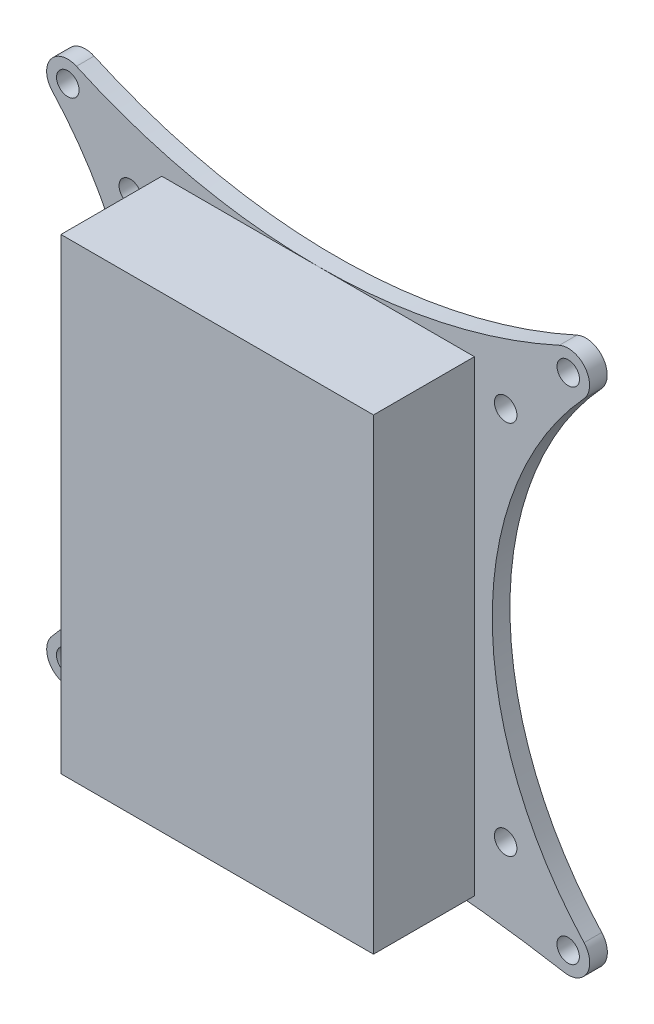
ISO-10303-21;
HEADER;
FILE_DESCRIPTION(('STEP AP214'),'2;1');
FILE_NAME('part.step','',(''),(''),'','','');
FILE_SCHEMA(('AUTOMOTIVE_DESIGN { 1 0 10303 214 1 1 1 1 }'));
ENDSEC;
DATA;
#1=APPLICATION_CONTEXT('core data for automotive mechanical design processes');
#2=APPLICATION_PROTOCOL_DEFINITION('international standard','automotive_design',2000,#1);
#3=PRODUCT_CONTEXT('',#1,'mechanical');
#4=PRODUCT('Part','Part','',(#3));
#5=PRODUCT_RELATED_PRODUCT_CATEGORY('part','',(#4));
#6=PRODUCT_DEFINITION_FORMATION('','',#4);
#7=PRODUCT_DEFINITION_CONTEXT('part definition',#1,'design');
#8=PRODUCT_DEFINITION('design','',#6,#7);
#9=PRODUCT_DEFINITION_SHAPE('','',#8);
#10=(LENGTH_UNIT() NAMED_UNIT(*) SI_UNIT(.MILLI.,.METRE.));
#11=(NAMED_UNIT(*) PLANE_ANGLE_UNIT() SI_UNIT($,.RADIAN.));
#12=(NAMED_UNIT(*) SI_UNIT($,.STERADIAN.) SOLID_ANGLE_UNIT());
#13=UNCERTAINTY_MEASURE_WITH_UNIT(LENGTH_MEASURE(1.E-05),#10,'distance_accuracy_value','');
#14=(GEOMETRIC_REPRESENTATION_CONTEXT(3) GLOBAL_UNCERTAINTY_ASSIGNED_CONTEXT((#13)) GLOBAL_UNIT_ASSIGNED_CONTEXT((#10,
#11,#12)) REPRESENTATION_CONTEXT('',''));
#15=CARTESIAN_POINT('',(0.,0.,0.));
#16=DIRECTION('',(0.,0.,1.));
#17=DIRECTION('',(1.,0.,0.));
#18=AXIS2_PLACEMENT_3D('',#15,#16,#17);
#19=CARTESIAN_POINT('',(53866.236526674,50813.0724816717,11206.9817913948));
#20=DIRECTION('',(0.,0.,1.));
#21=DIRECTION('',(1.,0.,0.));
#22=AXIS2_PLACEMENT_3D('',#19,#20,#21);
#23=PLANE('',#22);
#24=DIRECTION('',(1.,0.,0.));
#25=VECTOR('',#24,1.);
#26=CARTESIAN_POINT('',(53872.4361428547,50659.490674846,11206.9817913948));
#27=LINE('',#26,#25);
#28=CARTESIAN_POINT('',(53841.4519200088,50659.490674846,11206.9817913948));
#29=VERTEX_POINT('',#28);
#30=CARTESIAN_POINT('',(53872.4361428547,50659.490674846,11206.9817913948));
#31=VERTEX_POINT('',#30);
#32=EDGE_CURVE('E11',#29,#31,#27,.T.);
#33=ORIENTED_EDGE('',*,*,#32,.F.);
#34=CARTESIAN_POINT('',(53841.4214614553,50373.3037581029,11206.9817913948));
#35=DIRECTION('',(0.,0.,-1.));
#36=DIRECTION('',(1.,0.,0.));
#37=AXIS2_PLACEMENT_3D('',#34,#35,#36);
#38=CIRCLE('',#37,286.186918363944);
#39=CARTESIAN_POINT('',(53890.323467102,50655.2816758312,11206.9817913948));
#40=VERTEX_POINT('',#39);
#41=EDGE_CURVE('E39',#29,#40,#38,.T.);
#42=ORIENTED_EDGE('',*,*,#41,.T.);
#43=CARTESIAN_POINT('',(53891.0500709466,50659.4714066283,11206.9817913948));
#44=DIRECTION('',(0.,0.,1.));
#45=DIRECTION('',(1.,0.,0.));
#46=AXIS2_PLACEMENT_3D('',#43,#44,#45);
#47=CIRCLE('',#46,4.25226966450147);
#48=CARTESIAN_POINT('',(53894.1813340825,50662.3483822059,11206.9817913948));
#49=VERTEX_POINT('',#48);
#50=EDGE_CURVE('E184',#40,#49,#47,.T.);
#51=ORIENTED_EDGE('',*,*,#50,.T.);
#52=CARTESIAN_POINT('',(53945.0160736304,50709.0548702347,11206.9817913948));
#53=DIRECTION('',(0.,0.,-1.));
#54=DIRECTION('',(1.,0.,0.));
#55=AXIS2_PLACEMENT_3D('',#52,#53,#54);
#56=CIRCLE('',#55,69.0338088829974);
#57=CARTESIAN_POINT('',(53894.1568705471,50755.7347184631,11206.9817913948));
#58=VERTEX_POINT('',#57);
#59=EDGE_CURVE('E196',#49,#58,#56,.T.);
#60=ORIENTED_EDGE('',*,*,#59,.T.);
#61=CARTESIAN_POINT('',(53891.0311162898,50758.6036138727,11206.9817913948));
#62=DIRECTION('',(0.,0.,1.));
#63=DIRECTION('',(1.,0.,0.));
#64=AXIS2_PLACEMENT_3D('',#61,#62,#63);
#65=CIRCLE('',#64,4.24274681643765);
#66=CARTESIAN_POINT('',(53889.2733394922,50762.4651059779,11206.9817913948));
#67=VERTEX_POINT('',#66);
#68=EDGE_CURVE('E198',#58,#67,#65,.T.);
#69=ORIENTED_EDGE('',*,*,#68,.T.);
#70=CARTESIAN_POINT('',(53841.4419370583,50867.5413494708,11206.9817913948));
#71=DIRECTION('',(0.,0.,-1.));
#72=DIRECTION('',(1.,0.,0.));
#73=AXIS2_PLACEMENT_3D('',#70,#71,#72);
#74=CIRCLE('',#73,115.450682134724);
#75=CARTESIAN_POINT('',(53841.4835790701,50752.090674846,11206.9817913948));
#76=VERTEX_POINT('',#75);
#77=EDGE_CURVE('E276',#67,#76,#74,.T.);
#78=ORIENTED_EDGE('',*,*,#77,.T.);
#79=DIRECTION('',(-1.,0.,0.));
#80=VECTOR('',#79,1.);
#81=CARTESIAN_POINT('',(53872.4361428547,50752.090674846,11206.9817913948));
#82=LINE('',#81,#80);
#83=CARTESIAN_POINT('',(53872.4361428547,50752.090674846,11206.9817913948));
#84=VERTEX_POINT('',#83);
#85=EDGE_CURVE('E56',#84,#76,#82,.T.);
#86=ORIENTED_EDGE('',*,*,#85,.F.);
#87=DIRECTION('',(0.,1.,0.));
#88=VECTOR('',#87,1.);
#89=CARTESIAN_POINT('',(53872.4361428547,50659.490674846,11206.9817913948));
#90=LINE('',#89,#88);
#91=EDGE_CURVE('E52',#31,#84,#90,.T.);
#92=ORIENTED_EDGE('',*,*,#91,.F.);
#93=EDGE_LOOP('',(#33,#42,#51,#60,#69,#78,#86,#92));
#94=FACE_BOUND('',#93,.T.);
#95=CARTESIAN_POINT('',(53878.6406236784,50746.2453268224,11206.9817913948));
#96=DIRECTION('',(0.,0.,1.));
#97=DIRECTION('',(1.,0.,0.));
#98=AXIS2_PLACEMENT_3D('',#95,#96,#97);
#99=CIRCLE('',#98,2.23432855572837);
#100=CARTESIAN_POINT('',(53880.8749522341,50746.2453268224,11206.9817913948));
#101=VERTEX_POINT('',#100);
#102=EDGE_CURVE('E162',#101,#101,#99,.T.);
#103=ORIENTED_EDGE('',*,*,#102,.F.);
#104=EDGE_LOOP('',(#103));
#105=FACE_BOUND('',#104,.T.);
#106=CARTESIAN_POINT('',(53891.022819083,50659.4551482337,11206.9817913948));
#107=DIRECTION('',(0.,0.,1.));
#108=DIRECTION('',(1.,0.,0.));
#109=AXIS2_PLACEMENT_3D('',#106,#107,#108);
#110=CIRCLE('',#109,2.22119419225094);
#111=CARTESIAN_POINT('',(53893.2440132753,50659.4551482337,11206.9817913948));
#112=VERTEX_POINT('',#111);
#113=EDGE_CURVE('E296',#112,#112,#110,.T.);
#114=ORIENTED_EDGE('',*,*,#113,.F.);
#115=EDGE_LOOP('',(#114));
#116=FACE_BOUND('',#115,.T.);
#117=CARTESIAN_POINT('',(53891.0466119028,50758.6404142351,11206.9817913948));
#118=DIRECTION('',(0.,0.,1.));
#119=DIRECTION('',(1.,0.,0.));
#120=AXIS2_PLACEMENT_3D('',#117,#118,#119);
#121=CIRCLE('',#120,2.2288484259323);
#122=CARTESIAN_POINT('',(53893.2754603287,50758.6404142351,11206.9817913948));
#123=VERTEX_POINT('',#122);
#124=EDGE_CURVE('E205',#123,#123,#121,.T.);
#125=ORIENTED_EDGE('',*,*,#124,.F.);
#126=EDGE_LOOP('',(#125));
#127=FACE_BOUND('',#126,.T.);
#128=CARTESIAN_POINT('',(53878.6377604813,50671.8458577752,11206.9817913948));
#129=DIRECTION('',(0.,0.,1.));
#130=DIRECTION('',(1.,0.,0.));
#131=AXIS2_PLACEMENT_3D('',#128,#129,#130);
#132=CIRCLE('',#131,2.22926463892702);
#133=CARTESIAN_POINT('',(53880.8670251202,50671.8458577752,11206.9817913948));
#134=VERTEX_POINT('',#133);
#135=EDGE_CURVE('E302',#134,#134,#132,.T.);
#136=ORIENTED_EDGE('',*,*,#135,.F.);
#137=EDGE_LOOP('',(#136));
#138=FACE_BOUND('',#137,.T.);
#139=ADVANCED_FACE('F35',(#94,#105,#116,#127,#138),#23,.T.);
#140=CARTESIAN_POINT('',(53810.4676971633,50659.490674846,11206.9817913948));
#141=VERTEX_POINT('',#140);
#142=CARTESIAN_POINT('',(53841.3910029018,50659.490674846,11206.9817913948));
#143=VERTEX_POINT('',#142);
#144=EDGE_CURVE('E156',#141,#143,#27,.T.);
#145=ORIENTED_EDGE('',*,*,#144,.F.);
#146=DIRECTION('',(0.,-1.,0.));
#147=VECTOR('',#146,1.);
#148=CARTESIAN_POINT('',(53810.4676971633,50659.490674846,11206.9817913948));
#149=LINE('',#148,#147);
#150=CARTESIAN_POINT('',(53810.4676971633,50752.090674846,11206.9817913948));
#151=VERTEX_POINT('',#150);
#152=EDGE_CURVE('E171',#151,#141,#149,.T.);
#153=ORIENTED_EDGE('',*,*,#152,.F.);
#154=CARTESIAN_POINT('',(53841.4002950465,50752.090674846,11206.9817913948));
#155=VERTEX_POINT('',#154);
#156=EDGE_CURVE('E45',#155,#151,#82,.T.);
#157=ORIENTED_EDGE('',*,*,#156,.F.);
#158=CARTESIAN_POINT('',(53793.5347469828,50762.4996380203,11206.9817913948));
#159=VERTEX_POINT('',#158);
#160=EDGE_CURVE('E219',#155,#159,#74,.T.);
#161=ORIENTED_EDGE('',*,*,#160,.T.);
#162=CARTESIAN_POINT('',(53791.803145055,50758.7029129408,11206.9817913948));
#163=DIRECTION('',(0.,0.,1.));
#164=DIRECTION('',(1.,0.,0.));
#165=AXIS2_PLACEMENT_3D('',#162,#163,#164);
#166=CIRCLE('',#165,4.17295657371203);
#167=CARTESIAN_POINT('',(53788.7221584035,50755.8884702216,11206.9817913948));
#168=VERTEX_POINT('',#167);
#169=EDGE_CURVE('E274',#159,#168,#166,.T.);
#170=ORIENTED_EDGE('',*,*,#169,.T.);
#171=CARTESIAN_POINT('',(53737.4814415555,50709.0807171303,11206.9817913948));
#172=DIRECTION('',(0.,0.,-1.));
#173=DIRECTION('',(1.,0.,0.));
#174=AXIS2_PLACEMENT_3D('',#171,#172,#173);
#175=CIRCLE('',#174,69.4015620325751);
#176=CARTESIAN_POINT('',(53788.7423088421,50662.2950323796,11206.9817913948));
#177=VERTEX_POINT('',#176);
#178=EDGE_CURVE('E270',#168,#177,#175,.T.);
#179=ORIENTED_EDGE('',*,*,#178,.T.);
#180=CARTESIAN_POINT('',(53791.8592697381,50659.4501887868,11206.9817913948));
#181=DIRECTION('',(0.,0.,1.));
#182=DIRECTION('',(1.,0.,0.));
#183=AXIS2_PLACEMENT_3D('',#180,#181,#182);
#184=CIRCLE('',#183,4.22002136193234);
#185=CARTESIAN_POINT('',(53792.579478105,50655.2920786147,11206.9817913948));
#186=VERTEX_POINT('',#185);
#187=EDGE_CURVE('E192',#177,#186,#184,.T.);
#188=ORIENTED_EDGE('',*,*,#187,.T.);
#189=EDGE_CURVE('E182',#186,#143,#38,.T.);
#190=ORIENTED_EDGE('',*,*,#189,.T.);
#191=EDGE_LOOP('',(#145,#153,#157,#161,#170,#179,#188,#190));
#192=FACE_BOUND('',#191,.T.);
#193=CARTESIAN_POINT('',(53804.2219001641,50746.2488154693,11206.9817913948));
#194=DIRECTION('',(0.,0.,1.));
#195=DIRECTION('',(1.,0.,0.));
#196=AXIS2_PLACEMENT_3D('',#193,#194,#195);
#197=CIRCLE('',#196,2.22796232855812);
#198=CARTESIAN_POINT('',(53806.4498624927,50746.2488154693,11206.9817913948));
#199=VERTEX_POINT('',#198);
#200=EDGE_CURVE('E314',#199,#199,#197,.T.);
#201=ORIENTED_EDGE('',*,*,#200,.F.);
#202=EDGE_LOOP('',(#201));
#203=FACE_BOUND('',#202,.T.);
#204=CARTESIAN_POINT('',(53791.8266657831,50659.465130778,11206.9817913948));
#205=DIRECTION('',(0.,0.,1.));
#206=DIRECTION('',(1.,0.,0.));
#207=AXIS2_PLACEMENT_3D('',#204,#205,#206);
#208=CIRCLE('',#207,2.25538363704637);
#209=CARTESIAN_POINT('',(53794.0820494202,50659.465130778,11206.9817913948));
#210=VERTEX_POINT('',#209);
#211=EDGE_CURVE('E290',#210,#210,#208,.T.);
#212=ORIENTED_EDGE('',*,*,#211,.F.);
#213=EDGE_LOOP('',(#212));
#214=FACE_BOUND('',#213,.T.);
#215=CARTESIAN_POINT('',(53791.8279905263,50758.6482130844,11206.9817913948));
#216=DIRECTION('',(0.,0.,1.));
#217=DIRECTION('',(1.,0.,0.));
#218=AXIS2_PLACEMENT_3D('',#215,#216,#217);
#219=CIRCLE('',#218,2.23251509569496);
#220=CARTESIAN_POINT('',(53794.060505622,50758.6482130844,11206.9817913948));
#221=VERTEX_POINT('',#220);
#222=EDGE_CURVE('E284',#221,#221,#219,.T.);
#223=ORIENTED_EDGE('',*,*,#222,.F.);
#224=EDGE_LOOP('',(#223));
#225=FACE_BOUND('',#224,.T.);
#226=CARTESIAN_POINT('',(53804.2099616032,50671.8274460977,11206.9817913948));
#227=DIRECTION('',(0.,0.,1.));
#228=DIRECTION('',(1.,0.,0.));
#229=AXIS2_PLACEMENT_3D('',#226,#227,#228);
#230=CIRCLE('',#229,2.22215325220402);
#231=CARTESIAN_POINT('',(53806.4321148554,50671.8274460977,11206.9817913948));
#232=VERTEX_POINT('',#231);
#233=EDGE_CURVE('E308',#232,#232,#230,.T.);
#234=ORIENTED_EDGE('',*,*,#233,.F.);
#235=EDGE_LOOP('',(#234));
#236=FACE_BOUND('',#235,.T.);
#237=ADVANCED_FACE('F376',(#192,#203,#214,#225,#236),#23,.T.);
#238=CARTESIAN_POINT('',(53866.236526674,50813.0724816717,11203.4817913948));
#239=DIRECTION('',(0.,0.,1.));
#240=DIRECTION('',(1.,0.,0.));
#241=AXIS2_PLACEMENT_3D('',#238,#239,#240);
#242=PLANE('',#241);
#243=CARTESIAN_POINT('',(53841.4419370583,50867.5413494708,11203.4817913948));
#244=DIRECTION('',(0.,0.,-1.));
#245=DIRECTION('',(1.,0.,0.));
#246=AXIS2_PLACEMENT_3D('',#243,#244,#245);
#247=CIRCLE('',#246,115.450682134724);
#248=CARTESIAN_POINT('',(53889.2733394922,50762.4651059779,11203.4817913948));
#249=VERTEX_POINT('',#248);
#250=CARTESIAN_POINT('',(53793.5347469828,50762.4996380203,11203.4817913948));
#251=VERTEX_POINT('',#250);
#252=EDGE_CURVE('E201',#249,#251,#247,.T.);
#253=ORIENTED_EDGE('',*,*,#252,.F.);
#254=CARTESIAN_POINT('',(53891.0311162898,50758.6036138727,11203.4817913948));
#255=DIRECTION('',(0.,0.,1.));
#256=DIRECTION('',(1.,0.,0.));
#257=AXIS2_PLACEMENT_3D('',#254,#255,#256);
#258=CIRCLE('',#257,4.24274681643765);
#259=CARTESIAN_POINT('',(53894.1568705471,50755.7347184631,11203.4817913948));
#260=VERTEX_POINT('',#259);
#261=EDGE_CURVE('E217',#260,#249,#258,.T.);
#262=ORIENTED_EDGE('',*,*,#261,.F.);
#263=CARTESIAN_POINT('',(53945.0160736304,50709.0548702347,11203.4817913948));
#264=DIRECTION('',(0.,0.,-1.));
#265=DIRECTION('',(1.,0.,0.));
#266=AXIS2_PLACEMENT_3D('',#263,#264,#265);
#267=CIRCLE('',#266,69.0338088829974);
#268=CARTESIAN_POINT('',(53894.1813340825,50662.3483822059,11203.4817913948));
#269=VERTEX_POINT('',#268);
#270=EDGE_CURVE('E215',#269,#260,#267,.T.);
#271=ORIENTED_EDGE('',*,*,#270,.F.);
#272=CARTESIAN_POINT('',(53891.0500709466,50659.4714066283,11203.4817913948));
#273=DIRECTION('',(0.,0.,1.));
#274=DIRECTION('',(1.,0.,0.));
#275=AXIS2_PLACEMENT_3D('',#272,#273,#274);
#276=CIRCLE('',#275,4.25226966450147);
#277=CARTESIAN_POINT('',(53890.323467102,50655.2816758312,11203.4817913948));
#278=VERTEX_POINT('',#277);
#279=EDGE_CURVE('E213',#278,#269,#276,.T.);
#280=ORIENTED_EDGE('',*,*,#279,.F.);
#281=CARTESIAN_POINT('',(53841.4214614553,50373.3037581029,11203.4817913948));
#282=DIRECTION('',(0.,0.,-1.));
#283=DIRECTION('',(1.,0.,0.));
#284=AXIS2_PLACEMENT_3D('',#281,#282,#283);
#285=CIRCLE('',#284,286.186918363944);
#286=CARTESIAN_POINT('',(53792.579478105,50655.2920786147,11203.4817913948));
#287=VERTEX_POINT('',#286);
#288=EDGE_CURVE('E211',#287,#278,#285,.T.);
#289=ORIENTED_EDGE('',*,*,#288,.F.);
#290=CARTESIAN_POINT('',(53791.8592697381,50659.4501887868,11203.4817913948));
#291=DIRECTION('',(0.,0.,1.));
#292=DIRECTION('',(1.,0.,0.));
#293=AXIS2_PLACEMENT_3D('',#290,#291,#292);
#294=CIRCLE('',#293,4.22002136193234);
#295=CARTESIAN_POINT('',(53788.7423088421,50662.2950323796,11203.4817913948));
#296=VERTEX_POINT('',#295);
#297=EDGE_CURVE('E209',#296,#287,#294,.T.);
#298=ORIENTED_EDGE('',*,*,#297,.F.);
#299=CARTESIAN_POINT('',(53737.4814415555,50709.0807171303,11203.4817913948));
#300=DIRECTION('',(0.,0.,-1.));
#301=DIRECTION('',(1.,0.,0.));
#302=AXIS2_PLACEMENT_3D('',#299,#300,#301);
#303=CIRCLE('',#302,69.4015620325751);
#304=CARTESIAN_POINT('',(53788.7221584035,50755.8884702216,11203.4817913948));
#305=VERTEX_POINT('',#304);
#306=EDGE_CURVE('E207',#305,#296,#303,.T.);
#307=ORIENTED_EDGE('',*,*,#306,.F.);
#308=CARTESIAN_POINT('',(53791.803145055,50758.7029129408,11203.4817913948));
#309=DIRECTION('',(0.,0.,1.));
#310=DIRECTION('',(1.,0.,0.));
#311=AXIS2_PLACEMENT_3D('',#308,#309,#310);
#312=CIRCLE('',#311,4.17295657371203);
#313=EDGE_CURVE('E204',#251,#305,#312,.T.);
#314=ORIENTED_EDGE('',*,*,#313,.F.);
#315=EDGE_LOOP('',(#253,#262,#271,#280,#289,#298,#307,#314));
#316=FACE_BOUND('',#315,.T.);
#317=CARTESIAN_POINT('',(53891.0466119028,50758.6404142351,11203.4817913948));
#318=DIRECTION('',(0.,0.,1.));
#319=DIRECTION('',(1.,0.,0.));
#320=AXIS2_PLACEMENT_3D('',#317,#318,#319);
#321=CIRCLE('',#320,2.2288484259323);
#322=CARTESIAN_POINT('',(53893.2754603287,50758.6404142351,11203.4817913948));
#323=VERTEX_POINT('',#322);
#324=EDGE_CURVE('E281',#323,#323,#321,.T.);
#325=ORIENTED_EDGE('',*,*,#324,.T.);
#326=EDGE_LOOP('',(#325));
#327=FACE_BOUND('',#326,.T.);
#328=CARTESIAN_POINT('',(53791.8279905263,50758.6482130844,11203.4817913948));
#329=DIRECTION('',(0.,0.,1.));
#330=DIRECTION('',(1.,0.,0.));
#331=AXIS2_PLACEMENT_3D('',#328,#329,#330);
#332=CIRCLE('',#331,2.23251509569496);
#333=CARTESIAN_POINT('',(53794.060505622,50758.6482130844,11203.4817913948));
#334=VERTEX_POINT('',#333);
#335=EDGE_CURVE('E287',#334,#334,#332,.T.);
#336=ORIENTED_EDGE('',*,*,#335,.T.);
#337=EDGE_LOOP('',(#336));
#338=FACE_BOUND('',#337,.T.);
#339=CARTESIAN_POINT('',(53791.8266657831,50659.465130778,11203.4817913948));
#340=DIRECTION('',(0.,0.,1.));
#341=DIRECTION('',(1.,0.,0.));
#342=AXIS2_PLACEMENT_3D('',#339,#340,#341);
#343=CIRCLE('',#342,2.25538363704637);
#344=CARTESIAN_POINT('',(53794.0820494202,50659.465130778,11203.4817913948));
#345=VERTEX_POINT('',#344);
#346=EDGE_CURVE('E293',#345,#345,#343,.T.);
#347=ORIENTED_EDGE('',*,*,#346,.T.);
#348=EDGE_LOOP('',(#347));
#349=FACE_BOUND('',#348,.T.);
#350=CARTESIAN_POINT('',(53891.022819083,50659.4551482337,11203.4817913948));
#351=DIRECTION('',(0.,0.,1.));
#352=DIRECTION('',(1.,0.,0.));
#353=AXIS2_PLACEMENT_3D('',#350,#351,#352);
#354=CIRCLE('',#353,2.22119419225094);
#355=CARTESIAN_POINT('',(53893.2440132753,50659.4551482337,11203.4817913948));
#356=VERTEX_POINT('',#355);
#357=EDGE_CURVE('E299',#356,#356,#354,.T.);
#358=ORIENTED_EDGE('',*,*,#357,.T.);
#359=EDGE_LOOP('',(#358));
#360=FACE_BOUND('',#359,.T.);
#361=CARTESIAN_POINT('',(53878.6377604813,50671.8458577752,11203.4817913948));
#362=DIRECTION('',(0.,0.,1.));
#363=DIRECTION('',(1.,0.,0.));
#364=AXIS2_PLACEMENT_3D('',#361,#362,#363);
#365=CIRCLE('',#364,2.22926463892702);
#366=CARTESIAN_POINT('',(53880.8670251202,50671.8458577752,11203.4817913948));
#367=VERTEX_POINT('',#366);
#368=EDGE_CURVE('E305',#367,#367,#365,.T.);
#369=ORIENTED_EDGE('',*,*,#368,.T.);
#370=EDGE_LOOP('',(#369));
#371=FACE_BOUND('',#370,.T.);
#372=CARTESIAN_POINT('',(53804.2099616032,50671.8274460977,11203.4817913948));
#373=DIRECTION('',(0.,0.,1.));
#374=DIRECTION('',(1.,0.,0.));
#375=AXIS2_PLACEMENT_3D('',#372,#373,#374);
#376=CIRCLE('',#375,2.22215325220402);
#377=CARTESIAN_POINT('',(53806.4321148554,50671.8274460977,11203.4817913948));
#378=VERTEX_POINT('',#377);
#379=EDGE_CURVE('E311',#378,#378,#376,.T.);
#380=ORIENTED_EDGE('',*,*,#379,.T.);
#381=EDGE_LOOP('',(#380));
#382=FACE_BOUND('',#381,.T.);
#383=CARTESIAN_POINT('',(53804.2219001641,50746.2488154693,11203.4817913948));
#384=DIRECTION('',(0.,0.,1.));
#385=DIRECTION('',(1.,0.,0.));
#386=AXIS2_PLACEMENT_3D('',#383,#384,#385);
#387=CIRCLE('',#386,2.22796232855812);
#388=CARTESIAN_POINT('',(53806.4498624927,50746.2488154693,11203.4817913948));
#389=VERTEX_POINT('',#388);
#390=EDGE_CURVE('E317',#389,#389,#387,.T.);
#391=ORIENTED_EDGE('',*,*,#390,.T.);
#392=EDGE_LOOP('',(#391));
#393=FACE_BOUND('',#392,.T.);
#394=CARTESIAN_POINT('',(53878.6406236784,50746.2453268224,11203.4817913948));
#395=DIRECTION('',(0.,0.,1.));
#396=DIRECTION('',(1.,0.,0.));
#397=AXIS2_PLACEMENT_3D('',#394,#395,#396);
#398=CIRCLE('',#397,2.23432855572837);
#399=CARTESIAN_POINT('',(53880.8749522341,50746.2453268224,11203.4817913948));
#400=VERTEX_POINT('',#399);
#401=EDGE_CURVE('E159',#400,#400,#398,.T.);
#402=ORIENTED_EDGE('',*,*,#401,.T.);
#403=EDGE_LOOP('',(#402));
#404=FACE_BOUND('',#403,.T.);
#405=ADVANCED_FACE('F379',(#316,#327,#338,#349,#360,#371,#382,#393,#404),#242,.F.);
#406=CARTESIAN_POINT('',(53841.4419370583,50867.5413494708,11206.9817913948));
#407=DIRECTION('',(0.,0.,-1.));
#408=DIRECTION('',(-1.,0.,0.));
#409=AXIS2_PLACEMENT_3D('',#406,#407,#408);
#410=CYLINDRICAL_SURFACE('',#409,115.450682134724);
#411=ORIENTED_EDGE('',*,*,#252,.T.);
#412=DIRECTION('',(0.,0.,-1.));
#413=VECTOR('',#412,1.);
#414=CARTESIAN_POINT('',(53793.5347469828,50762.4996380203,11206.9817913948));
#415=LINE('',#414,#413);
#416=EDGE_CURVE('E177',#159,#251,#415,.T.);
#417=ORIENTED_EDGE('',*,*,#416,.F.);
#418=ORIENTED_EDGE('',*,*,#160,.F.);
#419=EDGE_CURVE('E280',#76,#155,#74,.T.);
#420=ORIENTED_EDGE('',*,*,#419,.F.);
#421=ORIENTED_EDGE('',*,*,#77,.F.);
#422=DIRECTION('',(0.,0.,-1.));
#423=VECTOR('',#422,1.);
#424=CARTESIAN_POINT('',(53889.2733394922,50762.4651059779,11206.9817913948));
#425=LINE('',#424,#423);
#426=EDGE_CURVE('E200',#67,#249,#425,.T.);
#427=ORIENTED_EDGE('',*,*,#426,.T.);
#428=EDGE_LOOP('',(#411,#417,#418,#420,#421,#427));
#429=FACE_BOUND('',#428,.T.);
#430=ADVANCED_FACE('F37',(#429),#410,.F.);
#431=CARTESIAN_POINT('',(53791.803145055,50758.7029129408,11206.9817913948));
#432=DIRECTION('',(0.,0.,-1.));
#433=DIRECTION('',(-1.,0.,0.));
#434=AXIS2_PLACEMENT_3D('',#431,#432,#433);
#435=CYLINDRICAL_SURFACE('',#434,4.17295657371203);
#436=ORIENTED_EDGE('',*,*,#313,.T.);
#437=DIRECTION('',(0.,0.,-1.));
#438=VECTOR('',#437,1.);
#439=CARTESIAN_POINT('',(53788.7221584035,50755.8884702216,11206.9817913948));
#440=LINE('',#439,#438);
#441=EDGE_CURVE('E236',#168,#305,#440,.T.);
#442=ORIENTED_EDGE('',*,*,#441,.F.);
#443=ORIENTED_EDGE('',*,*,#169,.F.);
#444=ORIENTED_EDGE('',*,*,#416,.T.);
#445=EDGE_LOOP('',(#436,#442,#443,#444));
#446=FACE_BOUND('',#445,.T.);
#447=ADVANCED_FACE('F402',(#446),#435,.T.);
#448=CARTESIAN_POINT('',(53737.4814415555,50709.0807171303,11206.9817913948));
#449=DIRECTION('',(0.,0.,-1.));
#450=DIRECTION('',(-1.,0.,0.));
#451=AXIS2_PLACEMENT_3D('',#448,#449,#450);
#452=CYLINDRICAL_SURFACE('',#451,69.4015620325751);
#453=ORIENTED_EDGE('',*,*,#306,.T.);
#454=DIRECTION('',(0.,0.,-1.));
#455=VECTOR('',#454,1.);
#456=CARTESIAN_POINT('',(53788.7423088421,50662.2950323796,11206.9817913948));
#457=LINE('',#456,#455);
#458=EDGE_CURVE('E234',#177,#296,#457,.T.);
#459=ORIENTED_EDGE('',*,*,#458,.F.);
#460=ORIENTED_EDGE('',*,*,#178,.F.);
#461=ORIENTED_EDGE('',*,*,#441,.T.);
#462=EDGE_LOOP('',(#453,#459,#460,#461));
#463=FACE_BOUND('',#462,.T.);
#464=ADVANCED_FACE('F399',(#463),#452,.F.);
#465=CARTESIAN_POINT('',(53791.8592697381,50659.4501887868,11206.9817913948));
#466=DIRECTION('',(0.,0.,-1.));
#467=DIRECTION('',(-1.,0.,0.));
#468=AXIS2_PLACEMENT_3D('',#465,#466,#467);
#469=CYLINDRICAL_SURFACE('',#468,4.22002136193234);
#470=ORIENTED_EDGE('',*,*,#297,.T.);
#471=DIRECTION('',(0.,0.,-1.));
#472=VECTOR('',#471,1.);
#473=CARTESIAN_POINT('',(53792.579478105,50655.2920786147,11206.9817913948));
#474=LINE('',#473,#472);
#475=EDGE_CURVE('E231',#186,#287,#474,.T.);
#476=ORIENTED_EDGE('',*,*,#475,.F.);
#477=ORIENTED_EDGE('',*,*,#187,.F.);
#478=ORIENTED_EDGE('',*,*,#458,.T.);
#479=EDGE_LOOP('',(#470,#476,#477,#478));
#480=FACE_BOUND('',#479,.T.);
#481=ADVANCED_FACE('F396',(#480),#469,.T.);
#482=CARTESIAN_POINT('',(53841.4214614553,50373.3037581029,11206.9817913948));
#483=DIRECTION('',(0.,0.,-1.));
#484=DIRECTION('',(-1.,0.,0.));
#485=AXIS2_PLACEMENT_3D('',#482,#483,#484);
#486=CYLINDRICAL_SURFACE('',#485,286.186918363944);
#487=ORIENTED_EDGE('',*,*,#288,.T.);
#488=DIRECTION('',(0.,0.,-1.));
#489=VECTOR('',#488,1.);
#490=CARTESIAN_POINT('',(53890.323467102,50655.2816758312,11206.9817913948));
#491=LINE('',#490,#489);
#492=EDGE_CURVE('E228',#40,#278,#491,.T.);
#493=ORIENTED_EDGE('',*,*,#492,.F.);
#494=ORIENTED_EDGE('',*,*,#41,.F.);
#495=CARTESIAN_POINT('',(53841.3910029018,50659.490674846,11206.9817913948));
#496=DIRECTION('',(1.,0.,0.));
#497=VECTOR('',#496,1.);
#498=LINE('',#495,#497);
#499=EDGE_CURVE('E185',#143,#29,#498,.T.);
#500=ORIENTED_EDGE('',*,*,#499,.F.);
#501=ORIENTED_EDGE('',*,*,#189,.F.);
#502=ORIENTED_EDGE('',*,*,#475,.T.);
#503=EDGE_LOOP('',(#487,#493,#494,#500,#501,#502));
#504=FACE_BOUND('',#503,.T.);
#505=ADVANCED_FACE('F267',(#504),#486,.F.);
#506=CARTESIAN_POINT('',(53891.0500709466,50659.4714066283,11206.9817913948));
#507=DIRECTION('',(0.,0.,-1.));
#508=DIRECTION('',(-1.,0.,0.));
#509=AXIS2_PLACEMENT_3D('',#506,#507,#508);
#510=CYLINDRICAL_SURFACE('',#509,4.25226966450147);
#511=ORIENTED_EDGE('',*,*,#279,.T.);
#512=DIRECTION('',(0.,0.,-1.));
#513=VECTOR('',#512,1.);
#514=CARTESIAN_POINT('',(53894.1813340825,50662.3483822059,11206.9817913948));
#515=LINE('',#514,#513);
#516=EDGE_CURVE('E225',#49,#269,#515,.T.);
#517=ORIENTED_EDGE('',*,*,#516,.F.);
#518=ORIENTED_EDGE('',*,*,#50,.F.);
#519=ORIENTED_EDGE('',*,*,#492,.T.);
#520=EDGE_LOOP('',(#511,#517,#518,#519));
#521=FACE_BOUND('',#520,.T.);
#522=ADVANCED_FACE('F389',(#521),#510,.T.);
#523=CARTESIAN_POINT('',(53945.0160736304,50709.0548702347,11206.9817913948));
#524=DIRECTION('',(0.,0.,-1.));
#525=DIRECTION('',(-1.,0.,0.));
#526=AXIS2_PLACEMENT_3D('',#523,#524,#525);
#527=CYLINDRICAL_SURFACE('',#526,69.0338088829974);
#528=ORIENTED_EDGE('',*,*,#270,.T.);
#529=DIRECTION('',(0.,0.,-1.));
#530=VECTOR('',#529,1.);
#531=CARTESIAN_POINT('',(53894.1568705471,50755.7347184631,11206.9817913948));
#532=LINE('',#531,#530);
#533=EDGE_CURVE('E222',#58,#260,#532,.T.);
#534=ORIENTED_EDGE('',*,*,#533,.F.);
#535=ORIENTED_EDGE('',*,*,#59,.F.);
#536=ORIENTED_EDGE('',*,*,#516,.T.);
#537=EDGE_LOOP('',(#528,#534,#535,#536));
#538=FACE_BOUND('',#537,.T.);
#539=ADVANCED_FACE('F385',(#538),#527,.F.);
#540=CARTESIAN_POINT('',(53891.0311162898,50758.6036138727,11206.9817913948));
#541=DIRECTION('',(0.,0.,-1.));
#542=DIRECTION('',(-1.,0.,0.));
#543=AXIS2_PLACEMENT_3D('',#540,#541,#542);
#544=CYLINDRICAL_SURFACE('',#543,4.24274681643765);
#545=ORIENTED_EDGE('',*,*,#261,.T.);
#546=ORIENTED_EDGE('',*,*,#426,.F.);
#547=ORIENTED_EDGE('',*,*,#68,.F.);
#548=ORIENTED_EDGE('',*,*,#533,.T.);
#549=EDGE_LOOP('',(#545,#546,#547,#548));
#550=FACE_BOUND('',#549,.T.);
#551=ADVANCED_FACE('F374',(#550),#544,.T.);
#552=CARTESIAN_POINT('',(53891.0466119028,50758.6404142351,11206.9817913948));
#553=DIRECTION('',(0.,0.,-1.));
#554=DIRECTION('',(-1.,0.,0.));
#555=AXIS2_PLACEMENT_3D('',#552,#553,#554);
#556=CYLINDRICAL_SURFACE('',#555,2.2288484259323);
#557=ORIENTED_EDGE('',*,*,#124,.T.);
#558=EDGE_LOOP('',(#557));
#559=FACE_BOUND('',#558,.T.);
#560=ORIENTED_EDGE('',*,*,#324,.F.);
#561=EDGE_LOOP('',(#560));
#562=FACE_BOUND('',#561,.T.);
#563=ADVANCED_FACE('F370',(#559,#562),#556,.F.);
#564=CARTESIAN_POINT('',(53791.8279905263,50758.6482130844,11206.9817913948));
#565=DIRECTION('',(0.,0.,-1.));
#566=DIRECTION('',(-1.,0.,0.));
#567=AXIS2_PLACEMENT_3D('',#564,#565,#566);
#568=CYLINDRICAL_SURFACE('',#567,2.23251509569496);
#569=ORIENTED_EDGE('',*,*,#222,.T.);
#570=EDGE_LOOP('',(#569));
#571=FACE_BOUND('',#570,.T.);
#572=ORIENTED_EDGE('',*,*,#335,.F.);
#573=EDGE_LOOP('',(#572));
#574=FACE_BOUND('',#573,.T.);
#575=ADVANCED_FACE('F366',(#571,#574),#568,.F.);
#576=CARTESIAN_POINT('',(53791.8266657831,50659.465130778,11206.9817913948));
#577=DIRECTION('',(0.,0.,-1.));
#578=DIRECTION('',(-1.,0.,0.));
#579=AXIS2_PLACEMENT_3D('',#576,#577,#578);
#580=CYLINDRICAL_SURFACE('',#579,2.25538363704637);
#581=ORIENTED_EDGE('',*,*,#211,.T.);
#582=EDGE_LOOP('',(#581));
#583=FACE_BOUND('',#582,.T.);
#584=ORIENTED_EDGE('',*,*,#346,.F.);
#585=EDGE_LOOP('',(#584));
#586=FACE_BOUND('',#585,.T.);
#587=ADVANCED_FACE('F362',(#583,#586),#580,.F.);
#588=CARTESIAN_POINT('',(53891.022819083,50659.4551482337,11206.9817913948));
#589=DIRECTION('',(0.,0.,-1.));
#590=DIRECTION('',(-1.,0.,0.));
#591=AXIS2_PLACEMENT_3D('',#588,#589,#590);
#592=CYLINDRICAL_SURFACE('',#591,2.22119419225094);
#593=ORIENTED_EDGE('',*,*,#113,.T.);
#594=EDGE_LOOP('',(#593));
#595=FACE_BOUND('',#594,.T.);
#596=ORIENTED_EDGE('',*,*,#357,.F.);
#597=EDGE_LOOP('',(#596));
#598=FACE_BOUND('',#597,.T.);
#599=ADVANCED_FACE('F358',(#595,#598),#592,.F.);
#600=CARTESIAN_POINT('',(53878.6377604813,50671.8458577752,11206.9817913948));
#601=DIRECTION('',(0.,0.,-1.));
#602=DIRECTION('',(-1.,0.,0.));
#603=AXIS2_PLACEMENT_3D('',#600,#601,#602);
#604=CYLINDRICAL_SURFACE('',#603,2.22926463892702);
#605=ORIENTED_EDGE('',*,*,#135,.T.);
#606=EDGE_LOOP('',(#605));
#607=FACE_BOUND('',#606,.T.);
#608=ORIENTED_EDGE('',*,*,#368,.F.);
#609=EDGE_LOOP('',(#608));
#610=FACE_BOUND('',#609,.T.);
#611=ADVANCED_FACE('F354',(#607,#610),#604,.F.);
#612=CARTESIAN_POINT('',(53804.2099616032,50671.8274460977,11206.9817913948));
#613=DIRECTION('',(0.,0.,-1.));
#614=DIRECTION('',(-1.,0.,0.));
#615=AXIS2_PLACEMENT_3D('',#612,#613,#614);
#616=CYLINDRICAL_SURFACE('',#615,2.22215325220402);
#617=ORIENTED_EDGE('',*,*,#233,.T.);
#618=EDGE_LOOP('',(#617));
#619=FACE_BOUND('',#618,.T.);
#620=ORIENTED_EDGE('',*,*,#379,.F.);
#621=EDGE_LOOP('',(#620));
#622=FACE_BOUND('',#621,.T.);
#623=ADVANCED_FACE('F350',(#619,#622),#616,.F.);
#624=CARTESIAN_POINT('',(53804.2219001641,50746.2488154693,11206.9817913948));
#625=DIRECTION('',(0.,0.,-1.));
#626=DIRECTION('',(-1.,0.,0.));
#627=AXIS2_PLACEMENT_3D('',#624,#625,#626);
#628=CYLINDRICAL_SURFACE('',#627,2.22796232855812);
#629=ORIENTED_EDGE('',*,*,#200,.T.);
#630=EDGE_LOOP('',(#629));
#631=FACE_BOUND('',#630,.T.);
#632=ORIENTED_EDGE('',*,*,#390,.F.);
#633=EDGE_LOOP('',(#632));
#634=FACE_BOUND('',#633,.T.);
#635=ADVANCED_FACE('F346',(#631,#634),#628,.F.);
#636=CARTESIAN_POINT('',(53878.6406236784,50746.2453268224,11206.9817913948));
#637=DIRECTION('',(0.,0.,-1.));
#638=DIRECTION('',(-1.,0.,0.));
#639=AXIS2_PLACEMENT_3D('',#636,#637,#638);
#640=CYLINDRICAL_SURFACE('',#639,2.23432855572837);
#641=ORIENTED_EDGE('',*,*,#102,.T.);
#642=EDGE_LOOP('',(#641));
#643=FACE_BOUND('',#642,.T.);
#644=ORIENTED_EDGE('',*,*,#401,.F.);
#645=EDGE_LOOP('',(#644));
#646=FACE_BOUND('',#645,.T.);
#647=ADVANCED_FACE('F343',(#643,#646),#640,.F.);
#648=CARTESIAN_POINT('',(53787.6117906616,50655.2162816369,11206.9817913948));
#649=DIRECTION('',(0.,0.,1.));
#650=DIRECTION('',(1.,0.,0.));
#651=AXIS2_PLACEMENT_3D('',#648,#649,#650);
#652=PLANE('',#651);
#653=EDGE_CURVE('E247',#76,#155,#82,.T.);
#654=ORIENTED_EDGE('',*,*,#653,.F.);
#655=ORIENTED_EDGE('',*,*,#419,.T.);
#656=EDGE_LOOP('',(#654,#655));
#657=FACE_BOUND('',#656,.T.);
#658=ADVANCED_FACE('F335',(#657),#652,.F.);
#659=CARTESIAN_POINT('',(53872.4361428547,50659.490674846,11226.9817913948));
#660=DIRECTION('',(-1.,0.,0.));
#661=DIRECTION('',(0.,-1.,0.));
#662=AXIS2_PLACEMENT_3D('',#659,#660,#661);
#663=PLANE('',#662);
#664=ORIENTED_EDGE('',*,*,#91,.T.);
#665=DIRECTION('',(0.,0.,-1.));
#666=VECTOR('',#665,1.);
#667=CARTESIAN_POINT('',(53872.4361428547,50752.090674846,11226.9817913948));
#668=LINE('',#667,#666);
#669=CARTESIAN_POINT('',(53872.4361428547,50752.090674846,11226.9817913948));
#670=VERTEX_POINT('',#669);
#671=EDGE_CURVE('E140',#670,#84,#668,.T.);
#672=ORIENTED_EDGE('',*,*,#671,.F.);
#673=DIRECTION('',(0.,1.,0.));
#674=VECTOR('',#673,1.);
#675=CARTESIAN_POINT('',(53872.4361428547,50659.490674846,11226.9817913948));
#676=LINE('',#675,#674);
#677=CARTESIAN_POINT('',(53872.4361428547,50659.490674846,11226.9817913948));
#678=VERTEX_POINT('',#677);
#679=EDGE_CURVE('E147',#678,#670,#676,.T.);
#680=ORIENTED_EDGE('',*,*,#679,.F.);
#681=DIRECTION('',(0.,0.,-1.));
#682=VECTOR('',#681,1.);
#683=CARTESIAN_POINT('',(53872.4361428547,50659.490674846,11226.9817913948));
#684=LINE('',#683,#682);
#685=EDGE_CURVE('E254',#678,#31,#684,.T.);
#686=ORIENTED_EDGE('',*,*,#685,.T.);
#687=EDGE_LOOP('',(#664,#672,#680,#686));
#688=FACE_BOUND('',#687,.T.);
#689=ADVANCED_FACE('F158',(#688),#663,.F.);
#690=CARTESIAN_POINT('',(53872.4361428547,50752.090674846,11226.9817913948));
#691=DIRECTION('',(0.,-1.,0.));
#692=DIRECTION('',(1.,0.,0.));
#693=AXIS2_PLACEMENT_3D('',#690,#691,#692);
#694=PLANE('',#693);
#695=ORIENTED_EDGE('',*,*,#85,.T.);
#696=ORIENTED_EDGE('',*,*,#653,.T.);
#697=ORIENTED_EDGE('',*,*,#156,.T.);
#698=DIRECTION('',(0.,0.,-1.));
#699=VECTOR('',#698,1.);
#700=CARTESIAN_POINT('',(53810.4676971633,50752.090674846,11226.9817913948));
#701=LINE('',#700,#699);
#702=CARTESIAN_POINT('',(53810.4676971633,50752.090674846,11226.9817913948));
#703=VERTEX_POINT('',#702);
#704=EDGE_CURVE('E143',#703,#151,#701,.T.);
#705=ORIENTED_EDGE('',*,*,#704,.F.);
#706=DIRECTION('',(-1.,0.,0.));
#707=VECTOR('',#706,1.);
#708=CARTESIAN_POINT('',(53872.4361428547,50752.090674846,11226.9817913948));
#709=LINE('',#708,#707);
#710=EDGE_CURVE('E136',#670,#703,#709,.T.);
#711=ORIENTED_EDGE('',*,*,#710,.F.);
#712=ORIENTED_EDGE('',*,*,#671,.T.);
#713=EDGE_LOOP('',(#695,#696,#697,#705,#711,#712));
#714=FACE_BOUND('',#713,.T.);
#715=ADVANCED_FACE('F138',(#714),#694,.F.);
#716=CARTESIAN_POINT('',(53810.4676971633,50659.490674846,11226.9817913948));
#717=DIRECTION('',(1.,0.,0.));
#718=DIRECTION('',(0.,0.,-1.));
#719=AXIS2_PLACEMENT_3D('',#716,#717,#718);
#720=PLANE('',#719);
#721=ORIENTED_EDGE('',*,*,#152,.T.);
#722=DIRECTION('',(0.,0.,-1.));
#723=VECTOR('',#722,1.);
#724=CARTESIAN_POINT('',(53810.4676971633,50659.490674846,11226.9817913948));
#725=LINE('',#724,#723);
#726=CARTESIAN_POINT('',(53810.4676971633,50659.490674846,11226.9817913948));
#727=VERTEX_POINT('',#726);
#728=EDGE_CURVE('E164',#727,#141,#725,.T.);
#729=ORIENTED_EDGE('',*,*,#728,.F.);
#730=DIRECTION('',(0.,-1.,0.));
#731=VECTOR('',#730,1.);
#732=CARTESIAN_POINT('',(53810.4676971633,50659.490674846,11226.9817913948));
#733=LINE('',#732,#731);
#734=EDGE_CURVE('E146',#703,#727,#733,.T.);
#735=ORIENTED_EDGE('',*,*,#734,.F.);
#736=ORIENTED_EDGE('',*,*,#704,.T.);
#737=EDGE_LOOP('',(#721,#729,#735,#736));
#738=FACE_BOUND('',#737,.T.);
#739=ADVANCED_FACE('F259',(#738),#720,.F.);
#740=CARTESIAN_POINT('',(53872.4361428547,50659.490674846,11226.9817913948));
#741=DIRECTION('',(0.,1.,0.));
#742=DIRECTION('',(-1.,0.,0.));
#743=AXIS2_PLACEMENT_3D('',#740,#741,#742);
#744=PLANE('',#743);
#745=ORIENTED_EDGE('',*,*,#144,.T.);
#746=ORIENTED_EDGE('',*,*,#499,.T.);
#747=ORIENTED_EDGE('',*,*,#32,.T.);
#748=ORIENTED_EDGE('',*,*,#685,.F.);
#749=DIRECTION('',(1.,0.,0.));
#750=VECTOR('',#749,1.);
#751=CARTESIAN_POINT('',(53872.4361428547,50659.490674846,11226.9817913948));
#752=LINE('',#751,#750);
#753=EDGE_CURVE('E152',#727,#678,#752,.T.);
#754=ORIENTED_EDGE('',*,*,#753,.F.);
#755=ORIENTED_EDGE('',*,*,#728,.T.);
#756=EDGE_LOOP('',(#745,#746,#747,#748,#754,#755));
#757=FACE_BOUND('',#756,.T.);
#758=ADVANCED_FACE('F261',(#757),#744,.F.);
#759=CARTESIAN_POINT('',(53787.6117906616,50655.2162816369,11226.9817913948));
#760=DIRECTION('',(0.,0.,1.));
#761=DIRECTION('',(1.,0.,0.));
#762=AXIS2_PLACEMENT_3D('',#759,#760,#761);
#763=PLANE('',#762);
#764=ORIENTED_EDGE('',*,*,#679,.T.);
#765=ORIENTED_EDGE('',*,*,#710,.T.);
#766=ORIENTED_EDGE('',*,*,#734,.T.);
#767=ORIENTED_EDGE('',*,*,#753,.T.);
#768=EDGE_LOOP('',(#764,#765,#766,#767));
#769=FACE_BOUND('',#768,.T.);
#770=ADVANCED_FACE('F150',(#769),#763,.T.);
#771=CLOSED_SHELL('',(#139,#237,#405,#430,#447,#464,#481,#505,#522,#539,#551,#563,#575,#587,
#599,#611,#623,#635,#647,#658,#689,#715,#739,#758,#770));
#772=MANIFOLD_SOLID_BREP('B2',#771);
#773=ADVANCED_BREP_SHAPE_REPRESENTATION('',(#18,#772),#14);
#774=SHAPE_DEFINITION_REPRESENTATION(#9,#773);
ENDSEC;
END-ISO-10303-21;
